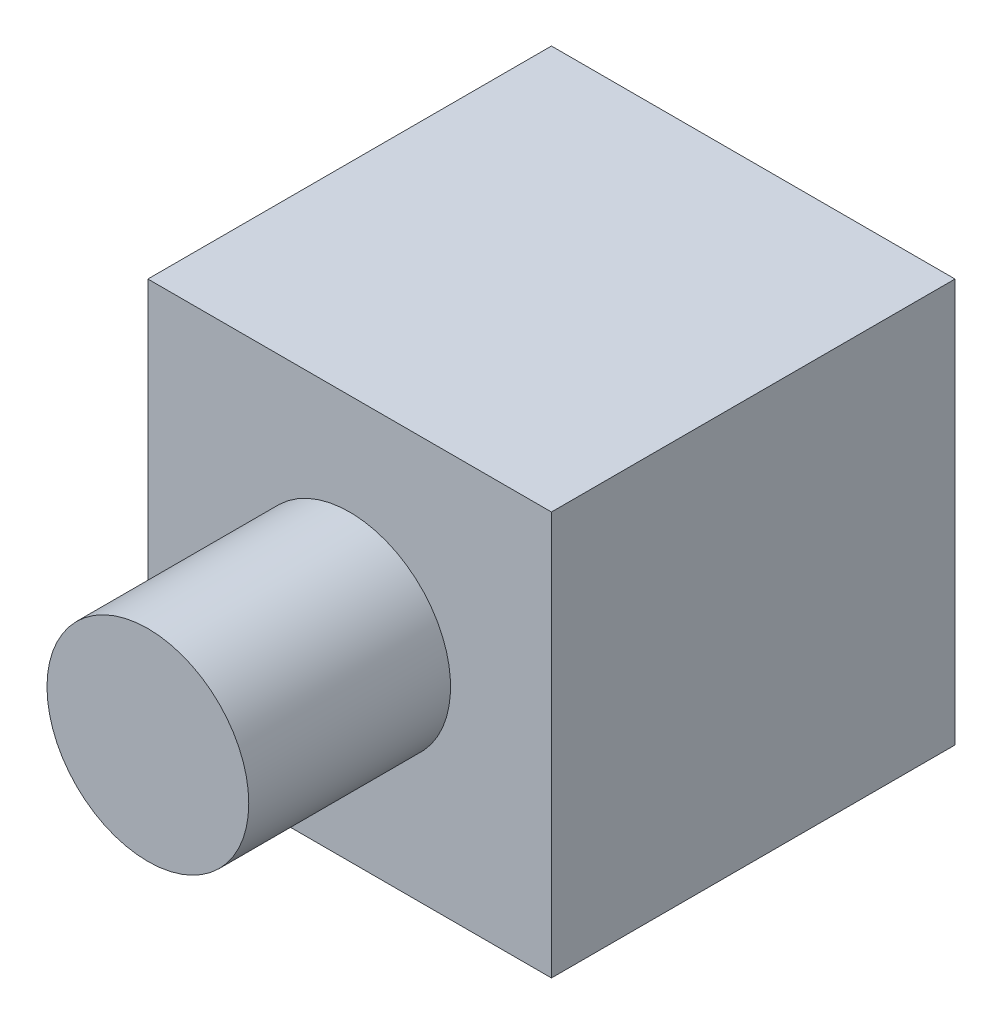
ISO-10303-21;
HEADER;
FILE_DESCRIPTION(('STEP AP214'),'2;1');
FILE_NAME('part.step','',(''),(''),'','','');
FILE_SCHEMA(('AUTOMOTIVE_DESIGN { 1 0 10303 214 1 1 1 1 }'));
ENDSEC;
DATA;
#1=APPLICATION_CONTEXT('core data for automotive mechanical design processes');
#2=APPLICATION_PROTOCOL_DEFINITION('international standard','automotive_design',2000,#1);
#3=PRODUCT_CONTEXT('',#1,'mechanical');
#4=PRODUCT('Part','Part','',(#3));
#5=PRODUCT_RELATED_PRODUCT_CATEGORY('part','',(#4));
#6=PRODUCT_DEFINITION_FORMATION('','',#4);
#7=PRODUCT_DEFINITION_CONTEXT('part definition',#1,'design');
#8=PRODUCT_DEFINITION('design','',#6,#7);
#9=PRODUCT_DEFINITION_SHAPE('','',#8);
#10=(LENGTH_UNIT() NAMED_UNIT(*) SI_UNIT(.MILLI.,.METRE.));
#11=(NAMED_UNIT(*) PLANE_ANGLE_UNIT() SI_UNIT($,.RADIAN.));
#12=(NAMED_UNIT(*) SI_UNIT($,.STERADIAN.) SOLID_ANGLE_UNIT());
#13=UNCERTAINTY_MEASURE_WITH_UNIT(LENGTH_MEASURE(1.E-05),#10,'distance_accuracy_value','');
#14=(GEOMETRIC_REPRESENTATION_CONTEXT(3) GLOBAL_UNCERTAINTY_ASSIGNED_CONTEXT((#13)) GLOBAL_UNIT_ASSIGNED_CONTEXT((#10,
#11,#12)) REPRESENTATION_CONTEXT('',''));
#15=CARTESIAN_POINT('',(0.,0.,0.));
#16=DIRECTION('',(0.,0.,1.));
#17=DIRECTION('',(1.,0.,0.));
#18=AXIS2_PLACEMENT_3D('',#15,#16,#17);
#19=CARTESIAN_POINT('',(25.4,-25.4,50.8));
#20=DIRECTION('',(-1.,0.,0.));
#21=DIRECTION('',(0.,0.,1.));
#22=AXIS2_PLACEMENT_3D('',#19,#20,#21);
#23=PLANE('',#22);
#24=DIRECTION('',(0.,1.,0.));
#25=VECTOR('',#24,1.);
#26=CARTESIAN_POINT('',(25.4,-25.4,0.));
#27=LINE('',#26,#25);
#28=CARTESIAN_POINT('',(25.4,-25.4,0.));
#29=VERTEX_POINT('',#28);
#30=CARTESIAN_POINT('',(25.4,25.4,0.));
#31=VERTEX_POINT('',#30);
#32=EDGE_CURVE('E98',#29,#31,#27,.T.);
#33=ORIENTED_EDGE('',*,*,#32,.T.);
#34=DIRECTION('',(0.,0.,-1.));
#35=VECTOR('',#34,1.);
#36=CARTESIAN_POINT('',(25.4,25.4,50.8));
#37=LINE('',#36,#35);
#38=CARTESIAN_POINT('',(25.4,25.4,50.8));
#39=VERTEX_POINT('',#38);
#40=EDGE_CURVE('E40',#39,#31,#37,.T.);
#41=ORIENTED_EDGE('',*,*,#40,.F.);
#42=DIRECTION('',(0.,1.,0.));
#43=VECTOR('',#42,1.);
#44=CARTESIAN_POINT('',(25.4,-25.4,50.8));
#45=LINE('',#44,#43);
#46=CARTESIAN_POINT('',(25.4,-25.4,50.8));
#47=VERTEX_POINT('',#46);
#48=EDGE_CURVE('E84',#47,#39,#45,.T.);
#49=ORIENTED_EDGE('',*,*,#48,.F.);
#50=DIRECTION('',(0.,0.,-1.));
#51=VECTOR('',#50,1.);
#52=CARTESIAN_POINT('',(25.4,-25.4,50.8));
#53=LINE('',#52,#51);
#54=EDGE_CURVE('E94',#47,#29,#53,.T.);
#55=ORIENTED_EDGE('',*,*,#54,.T.);
#56=EDGE_LOOP('',(#33,#41,#49,#55));
#57=FACE_BOUND('',#56,.T.);
#58=ADVANCED_FACE('F32',(#57),#23,.F.);
#59=CARTESIAN_POINT('',(-25.4,25.4,50.8));
#60=DIRECTION('',(0.,-1.,0.));
#61=DIRECTION('',(0.,0.,-1.));
#62=AXIS2_PLACEMENT_3D('',#59,#60,#61);
#63=PLANE('',#62);
#64=DIRECTION('',(-1.,0.,0.));
#65=VECTOR('',#64,1.);
#66=CARTESIAN_POINT('',(-25.4,25.4,0.));
#67=LINE('',#66,#65);
#68=CARTESIAN_POINT('',(-25.4,25.4,0.));
#69=VERTEX_POINT('',#68);
#70=EDGE_CURVE('E89',#31,#69,#67,.T.);
#71=ORIENTED_EDGE('',*,*,#70,.T.);
#72=DIRECTION('',(0.,0.,-1.));
#73=VECTOR('',#72,1.);
#74=CARTESIAN_POINT('',(-25.4,25.4,50.8));
#75=LINE('',#74,#73);
#76=CARTESIAN_POINT('',(-25.4,25.4,50.8));
#77=VERTEX_POINT('',#76);
#78=EDGE_CURVE('E87',#77,#69,#75,.T.);
#79=ORIENTED_EDGE('',*,*,#78,.F.);
#80=DIRECTION('',(-1.,0.,0.));
#81=VECTOR('',#80,1.);
#82=CARTESIAN_POINT('',(-25.4,25.4,50.8));
#83=LINE('',#82,#81);
#84=EDGE_CURVE('E79',#39,#77,#83,.T.);
#85=ORIENTED_EDGE('',*,*,#84,.F.);
#86=ORIENTED_EDGE('',*,*,#40,.T.);
#87=EDGE_LOOP('',(#71,#79,#85,#86));
#88=FACE_BOUND('',#87,.T.);
#89=ADVANCED_FACE('F88',(#88),#63,.F.);
#90=CARTESIAN_POINT('',(-25.4,-25.4,50.8));
#91=DIRECTION('',(1.,0.,0.));
#92=DIRECTION('',(0.,0.,-1.));
#93=AXIS2_PLACEMENT_3D('',#90,#91,#92);
#94=PLANE('',#93);
#95=DIRECTION('',(0.,-1.,0.));
#96=VECTOR('',#95,1.);
#97=CARTESIAN_POINT('',(-25.4,-25.4,0.));
#98=LINE('',#97,#96);
#99=CARTESIAN_POINT('',(-25.4,-25.4,0.));
#100=VERTEX_POINT('',#99);
#101=EDGE_CURVE('E65',#69,#100,#98,.T.);
#102=ORIENTED_EDGE('',*,*,#101,.T.);
#103=DIRECTION('',(0.,0.,-1.));
#104=VECTOR('',#103,1.);
#105=CARTESIAN_POINT('',(-25.4,-25.4,50.8));
#106=LINE('',#105,#104);
#107=CARTESIAN_POINT('',(-25.4,-25.4,50.8));
#108=VERTEX_POINT('',#107);
#109=EDGE_CURVE('E90',#108,#100,#106,.T.);
#110=ORIENTED_EDGE('',*,*,#109,.F.);
#111=DIRECTION('',(0.,-1.,0.));
#112=VECTOR('',#111,1.);
#113=CARTESIAN_POINT('',(-25.4,-25.4,50.8));
#114=LINE('',#113,#112);
#115=EDGE_CURVE('E82',#77,#108,#114,.T.);
#116=ORIENTED_EDGE('',*,*,#115,.F.);
#117=ORIENTED_EDGE('',*,*,#78,.T.);
#118=EDGE_LOOP('',(#102,#110,#116,#117));
#119=FACE_BOUND('',#118,.T.);
#120=ADVANCED_FACE('F92',(#119),#94,.F.);
#121=CARTESIAN_POINT('',(-25.4,-25.4,50.8));
#122=DIRECTION('',(0.,1.,0.));
#123=DIRECTION('',(0.,0.,1.));
#124=AXIS2_PLACEMENT_3D('',#121,#122,#123);
#125=PLANE('',#124);
#126=DIRECTION('',(1.,0.,0.));
#127=VECTOR('',#126,1.);
#128=CARTESIAN_POINT('',(-25.4,-25.4,0.));
#129=LINE('',#128,#127);
#130=EDGE_CURVE('E71',#100,#29,#129,.T.);
#131=ORIENTED_EDGE('',*,*,#130,.T.);
#132=ORIENTED_EDGE('',*,*,#54,.F.);
#133=DIRECTION('',(1.,0.,0.));
#134=VECTOR('',#133,1.);
#135=CARTESIAN_POINT('',(-25.4,-25.4,50.8));
#136=LINE('',#135,#134);
#137=EDGE_CURVE('E48',#108,#47,#136,.T.);
#138=ORIENTED_EDGE('',*,*,#137,.F.);
#139=ORIENTED_EDGE('',*,*,#109,.T.);
#140=EDGE_LOOP('',(#131,#132,#138,#139));
#141=FACE_BOUND('',#140,.T.);
#142=ADVANCED_FACE('F121',(#141),#125,.F.);
#143=CARTESIAN_POINT('',(0.,0.,50.8));
#144=DIRECTION('',(0.,0.,-1.));
#145=DIRECTION('',(-1.,0.,0.));
#146=AXIS2_PLACEMENT_3D('',#143,#144,#145);
#147=PLANE('',#146);
#148=CARTESIAN_POINT('',(0.,0.,50.8));
#149=DIRECTION('',(0.,0.,-1.));
#150=DIRECTION('',(-1.,0.,0.));
#151=AXIS2_PLACEMENT_3D('',#148,#149,#150);
#152=CIRCLE('',#151,12.7);
#153=CARTESIAN_POINT('',(-12.7,0.,50.8));
#154=VERTEX_POINT('',#153);
#155=EDGE_CURVE('E11',#154,#154,#152,.F.);
#156=ORIENTED_EDGE('',*,*,#155,.F.);
#157=EDGE_LOOP('',(#156));
#158=FACE_BOUND('',#157,.T.);
#159=ORIENTED_EDGE('',*,*,#48,.T.);
#160=ORIENTED_EDGE('',*,*,#84,.T.);
#161=ORIENTED_EDGE('',*,*,#115,.T.);
#162=ORIENTED_EDGE('',*,*,#137,.T.);
#163=EDGE_LOOP('',(#159,#160,#161,#162));
#164=FACE_BOUND('',#163,.T.);
#165=ADVANCED_FACE('F80',(#158,#164),#147,.F.);
#166=CARTESIAN_POINT('',(0.,0.,0.));
#167=DIRECTION('',(0.,0.,-1.));
#168=DIRECTION('',(-1.,0.,0.));
#169=AXIS2_PLACEMENT_3D('',#166,#167,#168);
#170=PLANE('',#169);
#171=CARTESIAN_POINT('',(0.,0.,0.));
#172=DIRECTION('',(0.,0.,-1.));
#173=DIRECTION('',(-1.,0.,0.));
#174=AXIS2_PLACEMENT_3D('',#171,#172,#173);
#175=CIRCLE('',#174,12.7);
#176=CARTESIAN_POINT('',(-12.7,0.,0.));
#177=VERTEX_POINT('',#176);
#178=EDGE_CURVE('E189',#177,#177,#175,.T.);
#179=ORIENTED_EDGE('',*,*,#178,.F.);
#180=EDGE_LOOP('',(#179));
#181=FACE_BOUND('',#180,.T.);
#182=ORIENTED_EDGE('',*,*,#32,.F.);
#183=ORIENTED_EDGE('',*,*,#130,.F.);
#184=ORIENTED_EDGE('',*,*,#101,.F.);
#185=ORIENTED_EDGE('',*,*,#70,.F.);
#186=EDGE_LOOP('',(#182,#183,#184,#185));
#187=FACE_BOUND('',#186,.T.);
#188=ADVANCED_FACE('F109',(#181,#187),#170,.T.);
#189=CARTESIAN_POINT('',(0.,0.,76.2));
#190=DIRECTION('',(0.,0.,-1.));
#191=DIRECTION('',(-1.,0.,0.));
#192=AXIS2_PLACEMENT_3D('',#189,#190,#191);
#193=CYLINDRICAL_SURFACE('',#192,12.7);
#194=CARTESIAN_POINT('',(0.,0.,76.2));
#195=DIRECTION('',(0.,0.,1.));
#196=DIRECTION('',(1.,0.,0.));
#197=AXIS2_PLACEMENT_3D('',#194,#195,#196);
#198=CIRCLE('',#197,12.7);
#199=CARTESIAN_POINT('',(12.7,0.,76.2));
#200=VERTEX_POINT('',#199);
#201=EDGE_CURVE('E101',#200,#200,#198,.T.);
#202=ORIENTED_EDGE('',*,*,#201,.F.);
#203=EDGE_LOOP('',(#202));
#204=FACE_BOUND('',#203,.T.);
#205=ORIENTED_EDGE('',*,*,#155,.T.);
#206=EDGE_LOOP('',(#205));
#207=FACE_BOUND('',#206,.T.);
#208=ADVANCED_FACE('F111',(#204,#207),#193,.T.);
#209=CARTESIAN_POINT('',(0.,0.,76.2));
#210=DIRECTION('',(0.,0.,1.));
#211=DIRECTION('',(1.,0.,0.));
#212=AXIS2_PLACEMENT_3D('',#209,#210,#211);
#213=PLANE('',#212);
#214=ORIENTED_EDGE('',*,*,#201,.T.);
#215=EDGE_LOOP('',(#214));
#216=FACE_BOUND('',#215,.T.);
#217=ADVANCED_FACE('F118',(#216),#213,.T.);
#218=CARTESIAN_POINT('',(0.,0.,25.4));
#219=DIRECTION('',(0.,0.,-1.));
#220=DIRECTION('',(-1.,0.,0.));
#221=AXIS2_PLACEMENT_3D('',#218,#219,#220);
#222=CYLINDRICAL_SURFACE('',#221,12.7);
#223=CARTESIAN_POINT('',(0.,0.,25.4));
#224=DIRECTION('',(0.,0.,-1.));
#225=DIRECTION('',(-1.,0.,0.));
#226=AXIS2_PLACEMENT_3D('',#223,#224,#225);
#227=CIRCLE('',#226,12.7);
#228=CARTESIAN_POINT('',(-12.7,0.,25.4));
#229=VERTEX_POINT('',#228);
#230=EDGE_CURVE('E188',#229,#229,#227,.T.);
#231=ORIENTED_EDGE('',*,*,#230,.F.);
#232=EDGE_LOOP('',(#231));
#233=FACE_BOUND('',#232,.T.);
#234=ORIENTED_EDGE('',*,*,#178,.T.);
#235=EDGE_LOOP('',(#234));
#236=FACE_BOUND('',#235,.T.);
#237=ADVANCED_FACE('F158',(#233,#236),#222,.F.);
#238=CARTESIAN_POINT('',(0.,0.,25.4));
#239=DIRECTION('',(0.,0.,-1.));
#240=DIRECTION('',(-1.,0.,0.));
#241=AXIS2_PLACEMENT_3D('',#238,#239,#240);
#242=PLANE('',#241);
#243=ORIENTED_EDGE('',*,*,#230,.T.);
#244=EDGE_LOOP('',(#243));
#245=FACE_BOUND('',#244,.T.);
#246=ADVANCED_FACE('F172',(#245),#242,.T.);
#247=CLOSED_SHELL('',(#58,#89,#120,#142,#165,#188,#208,#217,#237,#246));
#248=MANIFOLD_SOLID_BREP('B2',#247);
#249=ADVANCED_BREP_SHAPE_REPRESENTATION('',(#18,#248),#14);
#250=SHAPE_DEFINITION_REPRESENTATION(#9,#249);
ENDSEC;
END-ISO-10303-21;
